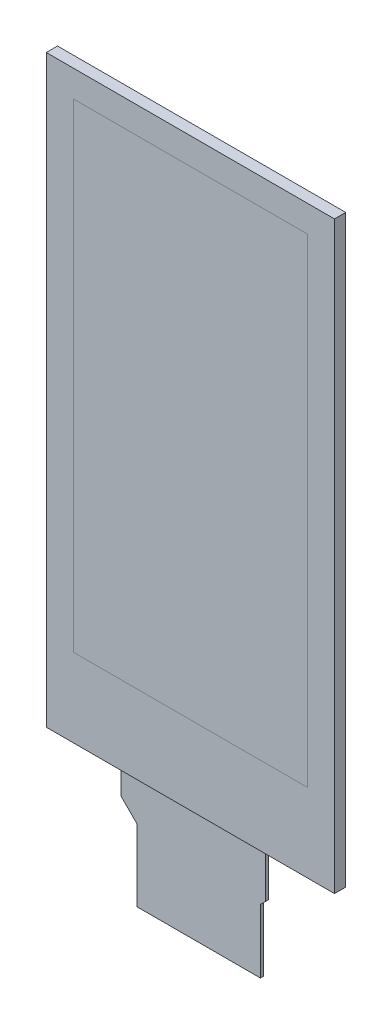
ISO-10303-21;
HEADER;
FILE_DESCRIPTION(('STEP AP214'),'2;1');
FILE_NAME('part.step','',(''),(''),'','','');
FILE_SCHEMA(('AUTOMOTIVE_DESIGN { 1 0 10303 214 1 1 1 1 }'));
ENDSEC;
DATA;
#1=APPLICATION_CONTEXT('core data for automotive mechanical design processes');
#2=APPLICATION_PROTOCOL_DEFINITION('international standard','automotive_design',2000,#1);
#3=PRODUCT_CONTEXT('',#1,'mechanical');
#4=PRODUCT('Part','Part','',(#3));
#5=PRODUCT_RELATED_PRODUCT_CATEGORY('part','',(#4));
#6=PRODUCT_DEFINITION_FORMATION('','',#4);
#7=PRODUCT_DEFINITION_CONTEXT('part definition',#1,'design');
#8=PRODUCT_DEFINITION('design','',#6,#7);
#9=PRODUCT_DEFINITION_SHAPE('','',#8);
#10=(LENGTH_UNIT() NAMED_UNIT(*) SI_UNIT(.MILLI.,.METRE.));
#11=(NAMED_UNIT(*) PLANE_ANGLE_UNIT() SI_UNIT($,.RADIAN.));
#12=(NAMED_UNIT(*) SI_UNIT($,.STERADIAN.) SOLID_ANGLE_UNIT());
#13=UNCERTAINTY_MEASURE_WITH_UNIT(LENGTH_MEASURE(1.E-05),#10,'distance_accuracy_value','');
#14=(GEOMETRIC_REPRESENTATION_CONTEXT(3) GLOBAL_UNCERTAINTY_ASSIGNED_CONTEXT((#13)) GLOBAL_UNIT_ASSIGNED_CONTEXT((#10,
#11,#12)) REPRESENTATION_CONTEXT('',''));
#15=CARTESIAN_POINT('',(0.,0.,0.));
#16=DIRECTION('',(0.,0.,1.));
#17=DIRECTION('',(1.,0.,0.));
#18=AXIS2_PLACEMENT_3D('',#15,#16,#17);
#19=CARTESIAN_POINT('',(22.0111555579125,-22.0111555579118,0.3));
#20=DIRECTION('',(-0.707106781186559,0.707106781186536,0.));
#21=DIRECTION('',(-0.707106781186536,-0.707106781186559,0.));
#22=AXIS2_PLACEMENT_3D('',#19,#20,#21);
#23=PLANE('',#22);
#24=DIRECTION('',(0.707106781186536,0.707106781186559,0.));
#25=VECTOR('',#24,1.);
#26=CARTESIAN_POINT('',(22.0111555579125,-22.0111555579118,0.));
#27=LINE('',#26,#25);
#28=CARTESIAN_POINT('',(6.2505,-37.7718111158248,0.));
#29=VERTEX_POINT('',#28);
#30=CARTESIAN_POINT('',(6.77033142500735,-37.2519796908174,0.));
#31=VERTEX_POINT('',#30);
#32=EDGE_CURVE('E146',#29,#31,#27,.T.);
#33=ORIENTED_EDGE('',*,*,#32,.T.);
#34=DIRECTION('',(0.,0.,-1.));
#35=VECTOR('',#34,1.);
#36=CARTESIAN_POINT('',(6.77033142500735,-37.2519796908174,0.3));
#37=LINE('',#36,#35);
#38=CARTESIAN_POINT('',(6.77033142500735,-37.2519796908174,0.3));
#39=VERTEX_POINT('',#38);
#40=EDGE_CURVE('E12',#39,#31,#37,.T.);
#41=ORIENTED_EDGE('',*,*,#40,.F.);
#42=DIRECTION('',(0.707106781186536,0.707106781186559,0.));
#43=VECTOR('',#42,1.);
#44=CARTESIAN_POINT('',(22.0111555579125,-22.0111555579118,0.3));
#45=LINE('',#44,#43);
#46=CARTESIAN_POINT('',(6.2505,-37.7718111158248,0.3));
#47=VERTEX_POINT('',#46);
#48=EDGE_CURVE('E160',#47,#39,#45,.T.);
#49=ORIENTED_EDGE('',*,*,#48,.F.);
#50=DIRECTION('',(0.,0.,-1.));
#51=VECTOR('',#50,1.);
#52=CARTESIAN_POINT('',(6.2505,-37.7718111158248,0.3));
#53=LINE('',#52,#51);
#54=EDGE_CURVE('E142',#47,#29,#53,.T.);
#55=ORIENTED_EDGE('',*,*,#54,.T.);
#56=EDGE_LOOP('',(#33,#41,#49,#55));
#57=FACE_BOUND('',#56,.T.);
#58=ADVANCED_FACE('F50',(#57),#23,.F.);
#59=CARTESIAN_POINT('',(6.77033142500736,0.,0.3));
#60=DIRECTION('',(-1.,0.,0.));
#61=DIRECTION('',(0.,-1.,0.));
#62=AXIS2_PLACEMENT_3D('',#59,#60,#61);
#63=PLANE('',#62);
#64=DIRECTION('',(0.,1.,0.));
#65=VECTOR('',#64,1.);
#66=CARTESIAN_POINT('',(6.77033142500736,0.,0.));
#67=LINE('',#66,#65);
#68=CARTESIAN_POINT('',(6.77033142500736,-32.225,0.));
#69=VERTEX_POINT('',#68);
#70=EDGE_CURVE('E149',#31,#69,#67,.T.);
#71=ORIENTED_EDGE('',*,*,#70,.T.);
#72=DIRECTION('',(0.,0.,-1.));
#73=VECTOR('',#72,1.);
#74=CARTESIAN_POINT('',(6.77033142500736,-32.225,0.3));
#75=LINE('',#74,#73);
#76=CARTESIAN_POINT('',(6.77033142500736,-32.225,0.3));
#77=VERTEX_POINT('',#76);
#78=EDGE_CURVE('E58',#77,#69,#75,.T.);
#79=ORIENTED_EDGE('',*,*,#78,.F.);
#80=DIRECTION('',(0.,1.,0.));
#81=VECTOR('',#80,1.);
#82=CARTESIAN_POINT('',(6.77033142500736,0.,0.3));
#83=LINE('',#82,#81);
#84=EDGE_CURVE('E109',#39,#77,#83,.T.);
#85=ORIENTED_EDGE('',*,*,#84,.F.);
#86=ORIENTED_EDGE('',*,*,#40,.T.);
#87=EDGE_LOOP('',(#71,#79,#85,#86));
#88=FACE_BOUND('',#87,.T.);
#89=ADVANCED_FACE('F195',(#88),#63,.F.);
#90=CARTESIAN_POINT('',(0.,-32.225,0.3));
#91=DIRECTION('',(0.,-1.,0.));
#92=DIRECTION('',(0.,0.,-1.));
#93=AXIS2_PLACEMENT_3D('',#90,#91,#92);
#94=PLANE('',#93);
#95=DIRECTION('',(-1.,0.,0.));
#96=VECTOR('',#95,1.);
#97=CARTESIAN_POINT('',(0.,-32.225,0.));
#98=LINE('',#97,#96);
#99=CARTESIAN_POINT('',(-7.88303653536633,-32.225,0.));
#100=VERTEX_POINT('',#99);
#101=EDGE_CURVE('E151',#69,#100,#98,.T.);
#102=ORIENTED_EDGE('',*,*,#101,.T.);
#103=DIRECTION('',(0.,0.,-1.));
#104=VECTOR('',#103,1.);
#105=CARTESIAN_POINT('',(-7.88303653536633,-32.225,0.3));
#106=LINE('',#105,#104);
#107=CARTESIAN_POINT('',(-7.88303653536633,-32.225,0.3));
#108=VERTEX_POINT('',#107);
#109=EDGE_CURVE('E167',#108,#100,#106,.T.);
#110=ORIENTED_EDGE('',*,*,#109,.F.);
#111=DIRECTION('',(-1.,0.,0.));
#112=VECTOR('',#111,1.);
#113=CARTESIAN_POINT('',(0.,-32.225,0.3));
#114=LINE('',#113,#112);
#115=EDGE_CURVE('E175',#77,#108,#114,.T.);
#116=ORIENTED_EDGE('',*,*,#115,.F.);
#117=ORIENTED_EDGE('',*,*,#78,.T.);
#118=EDGE_LOOP('',(#102,#110,#116,#117));
#119=FACE_BOUND('',#118,.T.);
#120=ADVANCED_FACE('F173',(#119),#94,.F.);
#121=CARTESIAN_POINT('',(-7.88303653536632,0.,0.3));
#122=DIRECTION('',(1.,0.,0.));
#123=DIRECTION('',(0.,1.,0.));
#124=AXIS2_PLACEMENT_3D('',#121,#122,#123);
#125=PLANE('',#124);
#126=DIRECTION('',(0.,-1.,0.));
#127=VECTOR('',#126,1.);
#128=CARTESIAN_POINT('',(-7.88303653536632,0.,0.));
#129=LINE('',#128,#127);
#130=CARTESIAN_POINT('',(-7.88303653536634,-35.3172476829733,0.));
#131=VERTEX_POINT('',#130);
#132=EDGE_CURVE('E153',#100,#131,#129,.T.);
#133=ORIENTED_EDGE('',*,*,#132,.T.);
#134=DIRECTION('',(0.,0.,-1.));
#135=VECTOR('',#134,1.);
#136=CARTESIAN_POINT('',(-7.88303653536634,-35.3172476829733,0.3));
#137=LINE('',#136,#135);
#138=CARTESIAN_POINT('',(-7.88303653536634,-35.3172476829733,0.3));
#139=VERTEX_POINT('',#138);
#140=EDGE_CURVE('E164',#139,#131,#137,.T.);
#141=ORIENTED_EDGE('',*,*,#140,.F.);
#142=DIRECTION('',(0.,-1.,0.));
#143=VECTOR('',#142,1.);
#144=CARTESIAN_POINT('',(-7.88303653536632,0.,0.3));
#145=LINE('',#144,#143);
#146=EDGE_CURVE('E187',#108,#139,#145,.T.);
#147=ORIENTED_EDGE('',*,*,#146,.F.);
#148=ORIENTED_EDGE('',*,*,#109,.T.);
#149=EDGE_LOOP('',(#133,#141,#147,#148));
#150=FACE_BOUND('',#149,.T.);
#151=ADVANCED_FACE('F183',(#150),#125,.F.);
#152=CARTESIAN_POINT('',(-21.6001421091698,-21.60014210917,0.3));
#153=DIRECTION('',(0.707106781186544,0.707106781186551,0.));
#154=DIRECTION('',(-0.707106781186551,0.707106781186544,0.));
#155=AXIS2_PLACEMENT_3D('',#152,#153,#154);
#156=PLANE('',#155);
#157=DIRECTION('',(0.707106781186551,-0.707106781186544,0.));
#158=VECTOR('',#157,1.);
#159=CARTESIAN_POINT('',(-21.6001421091698,-21.60014210917,0.));
#160=LINE('',#159,#158);
#161=CARTESIAN_POINT('',(-6.24949999999999,-36.9507842183396,0.));
#162=VERTEX_POINT('',#161);
#163=EDGE_CURVE('E155',#131,#162,#160,.T.);
#164=ORIENTED_EDGE('',*,*,#163,.T.);
#165=DIRECTION('',(0.,0.,-1.));
#166=VECTOR('',#165,1.);
#167=CARTESIAN_POINT('',(-6.24949999999999,-36.9507842183396,0.3));
#168=LINE('',#167,#166);
#169=CARTESIAN_POINT('',(-6.24949999999999,-36.9507842183396,0.3));
#170=VERTEX_POINT('',#169);
#171=EDGE_CURVE('E137',#170,#162,#168,.T.);
#172=ORIENTED_EDGE('',*,*,#171,.F.);
#173=DIRECTION('',(0.707106781186551,-0.707106781186544,0.));
#174=VECTOR('',#173,1.);
#175=CARTESIAN_POINT('',(-21.6001421091698,-21.60014210917,0.3));
#176=LINE('',#175,#174);
#177=EDGE_CURVE('E128',#139,#170,#176,.T.);
#178=ORIENTED_EDGE('',*,*,#177,.F.);
#179=ORIENTED_EDGE('',*,*,#140,.T.);
#180=EDGE_LOOP('',(#164,#172,#178,#179));
#181=FACE_BOUND('',#180,.T.);
#182=ADVANCED_FACE('F186',(#181),#156,.F.);
#183=CARTESIAN_POINT('',(-6.24949999999996,0.,0.3));
#184=DIRECTION('',(1.,0.,0.));
#185=DIRECTION('',(0.,1.,0.));
#186=AXIS2_PLACEMENT_3D('',#183,#184,#185);
#187=PLANE('',#186);
#188=DIRECTION('',(0.,-1.,0.));
#189=VECTOR('',#188,1.);
#190=CARTESIAN_POINT('',(-6.24949999999996,0.,0.));
#191=LINE('',#190,#189);
#192=CARTESIAN_POINT('',(-6.2495,-44.225,0.));
#193=VERTEX_POINT('',#192);
#194=EDGE_CURVE('E136',#162,#193,#191,.T.);
#195=ORIENTED_EDGE('',*,*,#194,.T.);
#196=DIRECTION('',(0.,0.,-1.));
#197=VECTOR('',#196,1.);
#198=CARTESIAN_POINT('',(-6.2495,-44.225,0.3));
#199=LINE('',#198,#197);
#200=CARTESIAN_POINT('',(-6.2495,-44.225,0.3));
#201=VERTEX_POINT('',#200);
#202=EDGE_CURVE('E133',#201,#193,#199,.T.);
#203=ORIENTED_EDGE('',*,*,#202,.F.);
#204=DIRECTION('',(0.,-1.,0.));
#205=VECTOR('',#204,1.);
#206=CARTESIAN_POINT('',(-6.24949999999996,0.,0.3));
#207=LINE('',#206,#205);
#208=EDGE_CURVE('E122',#170,#201,#207,.T.);
#209=ORIENTED_EDGE('',*,*,#208,.F.);
#210=ORIENTED_EDGE('',*,*,#171,.T.);
#211=EDGE_LOOP('',(#195,#203,#209,#210));
#212=FACE_BOUND('',#211,.T.);
#213=ADVANCED_FACE('F134',(#212),#187,.F.);
#214=CARTESIAN_POINT('',(0.,-44.225,0.3));
#215=DIRECTION('',(0.,1.,0.));
#216=DIRECTION('',(0.,0.,1.));
#217=AXIS2_PLACEMENT_3D('',#214,#215,#216);
#218=PLANE('',#217);
#219=DIRECTION('',(1.,0.,0.));
#220=VECTOR('',#219,1.);
#221=CARTESIAN_POINT('',(0.,-44.225,0.));
#222=LINE('',#221,#220);
#223=CARTESIAN_POINT('',(6.2505,-44.225,0.));
#224=VERTEX_POINT('',#223);
#225=EDGE_CURVE('E95',#193,#224,#222,.T.);
#226=ORIENTED_EDGE('',*,*,#225,.T.);
#227=DIRECTION('',(0.,0.,-1.));
#228=VECTOR('',#227,1.);
#229=CARTESIAN_POINT('',(6.2505,-44.225,0.3));
#230=LINE('',#229,#228);
#231=CARTESIAN_POINT('',(6.2505,-44.225,0.3));
#232=VERTEX_POINT('',#231);
#233=EDGE_CURVE('E138',#232,#224,#230,.T.);
#234=ORIENTED_EDGE('',*,*,#233,.F.);
#235=DIRECTION('',(1.,0.,0.));
#236=VECTOR('',#235,1.);
#237=CARTESIAN_POINT('',(0.,-44.225,0.3));
#238=LINE('',#237,#236);
#239=EDGE_CURVE('E126',#201,#232,#238,.T.);
#240=ORIENTED_EDGE('',*,*,#239,.F.);
#241=ORIENTED_EDGE('',*,*,#202,.T.);
#242=EDGE_LOOP('',(#226,#234,#240,#241));
#243=FACE_BOUND('',#242,.T.);
#244=ADVANCED_FACE('F140',(#243),#218,.F.);
#245=CARTESIAN_POINT('',(6.2505,0.,0.3));
#246=DIRECTION('',(-1.,0.,0.));
#247=DIRECTION('',(0.,0.,1.));
#248=AXIS2_PLACEMENT_3D('',#245,#246,#247);
#249=PLANE('',#248);
#250=DIRECTION('',(0.,1.,0.));
#251=VECTOR('',#250,1.);
#252=CARTESIAN_POINT('',(6.2505,0.,0.));
#253=LINE('',#252,#251);
#254=EDGE_CURVE('E101',#224,#29,#253,.T.);
#255=ORIENTED_EDGE('',*,*,#254,.T.);
#256=ORIENTED_EDGE('',*,*,#54,.F.);
#257=DIRECTION('',(0.,1.,0.));
#258=VECTOR('',#257,1.);
#259=CARTESIAN_POINT('',(6.2505,0.,0.3));
#260=LINE('',#259,#258);
#261=EDGE_CURVE('E66',#232,#47,#260,.T.);
#262=ORIENTED_EDGE('',*,*,#261,.F.);
#263=ORIENTED_EDGE('',*,*,#233,.T.);
#264=EDGE_LOOP('',(#255,#256,#262,#263));
#265=FACE_BOUND('',#264,.T.);
#266=ADVANCED_FACE('F211',(#265),#249,.F.);
#267=CARTESIAN_POINT('',(0.,0.,0.3));
#268=DIRECTION('',(0.,0.,1.));
#269=DIRECTION('',(1.,0.,0.));
#270=AXIS2_PLACEMENT_3D('',#267,#268,#269);
#271=PLANE('',#270);
#272=ORIENTED_EDGE('',*,*,#48,.T.);
#273=ORIENTED_EDGE('',*,*,#84,.T.);
#274=ORIENTED_EDGE('',*,*,#115,.T.);
#275=ORIENTED_EDGE('',*,*,#146,.T.);
#276=ORIENTED_EDGE('',*,*,#177,.T.);
#277=ORIENTED_EDGE('',*,*,#208,.T.);
#278=ORIENTED_EDGE('',*,*,#239,.T.);
#279=ORIENTED_EDGE('',*,*,#261,.T.);
#280=EDGE_LOOP('',(#272,#273,#274,#275,#276,#277,#278,#279));
#281=FACE_BOUND('',#280,.T.);
#282=ADVANCED_FACE('F124',(#281),#271,.T.);
#283=CARTESIAN_POINT('',(0.,0.,0.));
#284=DIRECTION('',(0.,0.,1.));
#285=DIRECTION('',(1.,0.,0.));
#286=AXIS2_PLACEMENT_3D('',#283,#284,#285);
#287=PLANE('',#286);
#288=ORIENTED_EDGE('',*,*,#32,.F.);
#289=ORIENTED_EDGE('',*,*,#254,.F.);
#290=ORIENTED_EDGE('',*,*,#225,.F.);
#291=ORIENTED_EDGE('',*,*,#194,.F.);
#292=ORIENTED_EDGE('',*,*,#163,.F.);
#293=ORIENTED_EDGE('',*,*,#132,.F.);
#294=ORIENTED_EDGE('',*,*,#101,.F.);
#295=ORIENTED_EDGE('',*,*,#70,.F.);
#296=EDGE_LOOP('',(#288,#289,#290,#291,#292,#293,#294,#295));
#297=FACE_BOUND('',#296,.T.);
#298=ADVANCED_FACE('F179',(#297),#287,.F.);
#299=CLOSED_SHELL('',(#58,#89,#120,#151,#182,#213,#244,#266,#282,#298));
#300=MANIFOLD_SOLID_BREP('B2',#299);
#301=CARTESIAN_POINT('',(0.,26.975,1.14));
#302=DIRECTION('',(0.,-1.,0.));
#303=DIRECTION('',(0.,0.,-1.));
#304=AXIS2_PLACEMENT_3D('',#301,#302,#303);
#305=PLANE('',#304);
#306=DIRECTION('',(-1.,0.,0.));
#307=VECTOR('',#306,1.);
#308=CARTESIAN_POINT('',(0.,26.975,0.));
#309=LINE('',#308,#307);
#310=CARTESIAN_POINT('',(14.6005,26.975,0.));
#311=VERTEX_POINT('',#310);
#312=CARTESIAN_POINT('',(-14.5995,26.975,0.));
#313=VERTEX_POINT('',#312);
#314=EDGE_CURVE('E394',#311,#313,#309,.T.);
#315=ORIENTED_EDGE('',*,*,#314,.T.);
#316=DIRECTION('',(0.,0.,-1.));
#317=VECTOR('',#316,1.);
#318=CARTESIAN_POINT('',(-14.5995,26.975,1.14));
#319=LINE('',#318,#317);
#320=CARTESIAN_POINT('',(-14.5995,26.975,1.14));
#321=VERTEX_POINT('',#320);
#322=EDGE_CURVE('E48',#321,#313,#319,.T.);
#323=ORIENTED_EDGE('',*,*,#322,.F.);
#324=DIRECTION('',(-1.,0.,0.));
#325=VECTOR('',#324,1.);
#326=CARTESIAN_POINT('',(0.,26.975,1.14));
#327=LINE('',#326,#325);
#328=CARTESIAN_POINT('',(14.6005,26.975,1.14));
#329=VERTEX_POINT('',#328);
#330=EDGE_CURVE('E366',#329,#321,#327,.T.);
#331=ORIENTED_EDGE('',*,*,#330,.F.);
#332=DIRECTION('',(0.,0.,-1.));
#333=VECTOR('',#332,1.);
#334=CARTESIAN_POINT('',(14.6005,26.975,1.14));
#335=LINE('',#334,#333);
#336=EDGE_CURVE('E306',#329,#311,#335,.T.);
#337=ORIENTED_EDGE('',*,*,#336,.T.);
#338=EDGE_LOOP('',(#315,#323,#331,#337));
#339=FACE_BOUND('',#338,.T.);
#340=ADVANCED_FACE('F287',(#339),#305,.F.);
#341=CARTESIAN_POINT('',(-14.5995,0.,1.14));
#342=DIRECTION('',(1.,0.,0.));
#343=DIRECTION('',(0.,0.,-1.));
#344=AXIS2_PLACEMENT_3D('',#341,#342,#343);
#345=PLANE('',#344);
#346=DIRECTION('',(0.,-1.,0.));
#347=VECTOR('',#346,1.);
#348=CARTESIAN_POINT('',(-14.5995,0.,0.));
#349=LINE('',#348,#347);
#350=CARTESIAN_POINT('',(-14.5995,-32.225,0.));
#351=VERTEX_POINT('',#350);
#352=EDGE_CURVE('E372',#313,#351,#349,.T.);
#353=ORIENTED_EDGE('',*,*,#352,.T.);
#354=DIRECTION('',(0.,0.,-1.));
#355=VECTOR('',#354,1.);
#356=CARTESIAN_POINT('',(-14.5995,-32.225,1.14));
#357=LINE('',#356,#355);
#358=CARTESIAN_POINT('',(-14.5995,-32.225,1.14));
#359=VERTEX_POINT('',#358);
#360=EDGE_CURVE('E297',#359,#351,#357,.T.);
#361=ORIENTED_EDGE('',*,*,#360,.F.);
#362=DIRECTION('',(0.,-1.,0.));
#363=VECTOR('',#362,1.);
#364=CARTESIAN_POINT('',(-14.5995,0.,1.14));
#365=LINE('',#364,#363);
#366=EDGE_CURVE('E360',#321,#359,#365,.T.);
#367=ORIENTED_EDGE('',*,*,#366,.F.);
#368=ORIENTED_EDGE('',*,*,#322,.T.);
#369=EDGE_LOOP('',(#353,#361,#367,#368));
#370=FACE_BOUND('',#369,.T.);
#371=ADVANCED_FACE('F371',(#370),#345,.F.);
#372=CARTESIAN_POINT('',(0.,-32.225,1.14));
#373=DIRECTION('',(0.,-1.,0.));
#374=DIRECTION('',(0.,0.,-1.));
#375=AXIS2_PLACEMENT_3D('',#372,#373,#374);
#376=PLANE('',#375);
#377=DIRECTION('',(-1.,0.,0.));
#378=VECTOR('',#377,1.);
#379=CARTESIAN_POINT('',(0.,-32.225,0.));
#380=LINE('',#379,#378);
#381=CARTESIAN_POINT('',(14.6005,-32.225,0.));
#382=VERTEX_POINT('',#381);
#383=EDGE_CURVE('E397',#382,#351,#380,.T.);
#384=ORIENTED_EDGE('',*,*,#383,.F.);
#385=DIRECTION('',(0.,0.,-1.));
#386=VECTOR('',#385,1.);
#387=CARTESIAN_POINT('',(14.6005,-32.225,1.14));
#388=LINE('',#387,#386);
#389=CARTESIAN_POINT('',(14.6005,-32.225,1.14));
#390=VERTEX_POINT('',#389);
#391=EDGE_CURVE('E332',#390,#382,#388,.T.);
#392=ORIENTED_EDGE('',*,*,#391,.F.);
#393=DIRECTION('',(-1.,0.,0.));
#394=VECTOR('',#393,1.);
#395=CARTESIAN_POINT('',(0.,-32.225,1.14));
#396=LINE('',#395,#394);
#397=EDGE_CURVE('E365',#390,#359,#396,.T.);
#398=ORIENTED_EDGE('',*,*,#397,.T.);
#399=ORIENTED_EDGE('',*,*,#360,.T.);
#400=EDGE_LOOP('',(#384,#392,#398,#399));
#401=FACE_BOUND('',#400,.T.);
#402=ADVANCED_FACE('F376',(#401),#376,.T.);
#403=CARTESIAN_POINT('',(-11.8525,0.,1.14));
#404=DIRECTION('',(1.,0.,0.));
#405=DIRECTION('',(0.,0.,-1.));
#406=AXIS2_PLACEMENT_3D('',#403,#404,#405);
#407=PLANE('',#406);
#408=DIRECTION('',(0.,-1.,0.));
#409=VECTOR('',#408,1.);
#410=CARTESIAN_POINT('',(-11.8525,0.,0.));
#411=LINE('',#410,#409);
#412=CARTESIAN_POINT('',(-11.8525,24.275,0.));
#413=VERTEX_POINT('',#412);
#414=CARTESIAN_POINT('',(-11.8525,-24.275,0.));
#415=VERTEX_POINT('',#414);
#416=EDGE_CURVE('E383',#413,#415,#411,.T.);
#417=ORIENTED_EDGE('',*,*,#416,.F.);
#418=DIRECTION('',(0.,0.,-1.));
#419=VECTOR('',#418,1.);
#420=CARTESIAN_POINT('',(-11.8525,24.275,1.14));
#421=LINE('',#420,#419);
#422=CARTESIAN_POINT('',(-11.8525,24.275,1.14));
#423=VERTEX_POINT('',#422);
#424=EDGE_CURVE('E291',#423,#413,#421,.T.);
#425=ORIENTED_EDGE('',*,*,#424,.F.);
#426=DIRECTION('',(0.,-1.,0.));
#427=VECTOR('',#426,1.);
#428=CARTESIAN_POINT('',(-11.8525,0.,1.14));
#429=LINE('',#428,#427);
#430=CARTESIAN_POINT('',(-11.8525,-24.275,1.14));
#431=VERTEX_POINT('',#430);
#432=EDGE_CURVE('E402',#423,#431,#429,.T.);
#433=ORIENTED_EDGE('',*,*,#432,.T.);
#434=DIRECTION('',(0.,0.,-1.));
#435=VECTOR('',#434,1.);
#436=CARTESIAN_POINT('',(-11.8525,-24.275,1.14));
#437=LINE('',#436,#435);
#438=EDGE_CURVE('E379',#431,#415,#437,.T.);
#439=ORIENTED_EDGE('',*,*,#438,.T.);
#440=EDGE_LOOP('',(#417,#425,#433,#439));
#441=FACE_BOUND('',#440,.T.);
#442=ADVANCED_FACE('F289',(#441),#407,.T.);
#443=CARTESIAN_POINT('',(0.,24.275,1.14));
#444=DIRECTION('',(0.,-1.,0.));
#445=DIRECTION('',(0.,0.,-1.));
#446=AXIS2_PLACEMENT_3D('',#443,#444,#445);
#447=PLANE('',#446);
#448=DIRECTION('',(-1.,0.,0.));
#449=VECTOR('',#448,1.);
#450=CARTESIAN_POINT('',(0.,24.275,0.));
#451=LINE('',#450,#449);
#452=CARTESIAN_POINT('',(11.8525,24.275,0.));
#453=VERTEX_POINT('',#452);
#454=EDGE_CURVE('E386',#453,#413,#451,.T.);
#455=ORIENTED_EDGE('',*,*,#454,.F.);
#456=DIRECTION('',(0.,0.,-1.));
#457=VECTOR('',#456,1.);
#458=CARTESIAN_POINT('',(11.8525,24.275,1.14));
#459=LINE('',#458,#457);
#460=CARTESIAN_POINT('',(11.8525,24.275,1.14));
#461=VERTEX_POINT('',#460);
#462=EDGE_CURVE('E408',#461,#453,#459,.T.);
#463=ORIENTED_EDGE('',*,*,#462,.F.);
#464=DIRECTION('',(-1.,0.,0.));
#465=VECTOR('',#464,1.);
#466=CARTESIAN_POINT('',(0.,24.275,1.14));
#467=LINE('',#466,#465);
#468=EDGE_CURVE('E417',#461,#423,#467,.T.);
#469=ORIENTED_EDGE('',*,*,#468,.T.);
#470=ORIENTED_EDGE('',*,*,#424,.T.);
#471=EDGE_LOOP('',(#455,#463,#469,#470));
#472=FACE_BOUND('',#471,.T.);
#473=ADVANCED_FACE('F415',(#472),#447,.T.);
#474=CARTESIAN_POINT('',(11.8525,0.,1.14));
#475=DIRECTION('',(1.,0.,0.));
#476=DIRECTION('',(0.,0.,-1.));
#477=AXIS2_PLACEMENT_3D('',#474,#475,#476);
#478=PLANE('',#477);
#479=DIRECTION('',(0.,-1.,0.));
#480=VECTOR('',#479,1.);
#481=CARTESIAN_POINT('',(11.8525,0.,0.));
#482=LINE('',#481,#480);
#483=CARTESIAN_POINT('',(11.8525,-24.275,0.));
#484=VERTEX_POINT('',#483);
#485=EDGE_CURVE('E389',#453,#484,#482,.T.);
#486=ORIENTED_EDGE('',*,*,#485,.T.);
#487=DIRECTION('',(0.,0.,-1.));
#488=VECTOR('',#487,1.);
#489=CARTESIAN_POINT('',(11.8525,-24.275,1.14));
#490=LINE('',#489,#488);
#491=CARTESIAN_POINT('',(11.8525,-24.275,1.14));
#492=VERTEX_POINT('',#491);
#493=EDGE_CURVE('E406',#492,#484,#490,.T.);
#494=ORIENTED_EDGE('',*,*,#493,.F.);
#495=DIRECTION('',(0.,-1.,0.));
#496=VECTOR('',#495,1.);
#497=CARTESIAN_POINT('',(11.8525,0.,1.14));
#498=LINE('',#497,#496);
#499=EDGE_CURVE('E430',#461,#492,#498,.T.);
#500=ORIENTED_EDGE('',*,*,#499,.F.);
#501=ORIENTED_EDGE('',*,*,#462,.T.);
#502=EDGE_LOOP('',(#486,#494,#500,#501));
#503=FACE_BOUND('',#502,.T.);
#504=ADVANCED_FACE('F424',(#503),#478,.F.);
#505=CARTESIAN_POINT('',(0.,-24.275,1.14));
#506=DIRECTION('',(0.,-1.,0.));
#507=DIRECTION('',(0.,0.,-1.));
#508=AXIS2_PLACEMENT_3D('',#505,#506,#507);
#509=PLANE('',#508);
#510=DIRECTION('',(-1.,0.,0.));
#511=VECTOR('',#510,1.);
#512=CARTESIAN_POINT('',(0.,-24.275,0.));
#513=LINE('',#512,#511);
#514=EDGE_CURVE('E391',#484,#415,#513,.T.);
#515=ORIENTED_EDGE('',*,*,#514,.T.);
#516=ORIENTED_EDGE('',*,*,#438,.F.);
#517=DIRECTION('',(-1.,0.,0.));
#518=VECTOR('',#517,1.);
#519=CARTESIAN_POINT('',(0.,-24.275,1.14));
#520=LINE('',#519,#518);
#521=EDGE_CURVE('E428',#492,#431,#520,.T.);
#522=ORIENTED_EDGE('',*,*,#521,.F.);
#523=ORIENTED_EDGE('',*,*,#493,.T.);
#524=EDGE_LOOP('',(#515,#516,#522,#523));
#525=FACE_BOUND('',#524,.T.);
#526=ADVANCED_FACE('F427',(#525),#509,.F.);
#527=CARTESIAN_POINT('',(14.6005,0.,1.14));
#528=DIRECTION('',(1.,0.,0.));
#529=DIRECTION('',(0.,0.,-1.));
#530=AXIS2_PLACEMENT_3D('',#527,#528,#529);
#531=PLANE('',#530);
#532=DIRECTION('',(0.,-1.,0.));
#533=VECTOR('',#532,1.);
#534=CARTESIAN_POINT('',(14.6005,0.,0.));
#535=LINE('',#534,#533);
#536=EDGE_CURVE('E399',#311,#382,#535,.T.);
#537=ORIENTED_EDGE('',*,*,#536,.F.);
#538=ORIENTED_EDGE('',*,*,#336,.F.);
#539=DIRECTION('',(0.,-1.,0.));
#540=VECTOR('',#539,1.);
#541=CARTESIAN_POINT('',(14.6005,0.,1.14));
#542=LINE('',#541,#540);
#543=EDGE_CURVE('E377',#329,#390,#542,.T.);
#544=ORIENTED_EDGE('',*,*,#543,.T.);
#545=ORIENTED_EDGE('',*,*,#391,.T.);
#546=EDGE_LOOP('',(#537,#538,#544,#545));
#547=FACE_BOUND('',#546,.T.);
#548=ADVANCED_FACE('F436',(#547),#531,.T.);
#549=CARTESIAN_POINT('',(0.,0.,1.14));
#550=DIRECTION('',(0.,0.,1.));
#551=DIRECTION('',(1.,0.,0.));
#552=AXIS2_PLACEMENT_3D('',#549,#550,#551);
#553=PLANE('',#552);
#554=ORIENTED_EDGE('',*,*,#432,.F.);
#555=ORIENTED_EDGE('',*,*,#468,.F.);
#556=ORIENTED_EDGE('',*,*,#499,.T.);
#557=ORIENTED_EDGE('',*,*,#521,.T.);
#558=EDGE_LOOP('',(#554,#555,#556,#557));
#559=FACE_BOUND('',#558,.T.);
#560=ORIENTED_EDGE('',*,*,#330,.T.);
#561=ORIENTED_EDGE('',*,*,#366,.T.);
#562=ORIENTED_EDGE('',*,*,#397,.F.);
#563=ORIENTED_EDGE('',*,*,#543,.F.);
#564=EDGE_LOOP('',(#560,#561,#562,#563));
#565=FACE_BOUND('',#564,.T.);
#566=ADVANCED_FACE('F362',(#559,#565),#553,.T.);
#567=CARTESIAN_POINT('',(0.,0.,0.));
#568=DIRECTION('',(0.,0.,1.));
#569=DIRECTION('',(1.,0.,0.));
#570=AXIS2_PLACEMENT_3D('',#567,#568,#569);
#571=PLANE('',#570);
#572=ORIENTED_EDGE('',*,*,#416,.T.);
#573=ORIENTED_EDGE('',*,*,#514,.F.);
#574=ORIENTED_EDGE('',*,*,#485,.F.);
#575=ORIENTED_EDGE('',*,*,#454,.T.);
#576=EDGE_LOOP('',(#572,#573,#574,#575));
#577=FACE_BOUND('',#576,.T.);
#578=ORIENTED_EDGE('',*,*,#314,.F.);
#579=ORIENTED_EDGE('',*,*,#536,.T.);
#580=ORIENTED_EDGE('',*,*,#383,.T.);
#581=ORIENTED_EDGE('',*,*,#352,.F.);
#582=EDGE_LOOP('',(#578,#579,#580,#581));
#583=FACE_BOUND('',#582,.T.);
#584=ADVANCED_FACE('F421',(#577,#583),#571,.F.);
#585=CLOSED_SHELL('',(#340,#371,#402,#442,#473,#504,#526,#548,#566,#584));
#586=MANIFOLD_SOLID_BREP('B6',#585);
#587=CARTESIAN_POINT('',(0.,24.275,1.14));
#588=DIRECTION('',(0.,-1.,0.));
#589=DIRECTION('',(0.,0.,-1.));
#590=AXIS2_PLACEMENT_3D('',#587,#588,#589);
#591=PLANE('',#590);
#592=DIRECTION('',(-1.,0.,0.));
#593=VECTOR('',#592,1.);
#594=CARTESIAN_POINT('',(0.,24.275,0.));
#595=LINE('',#594,#593);
#596=CARTESIAN_POINT('',(11.8525,24.275,0.));
#597=VERTEX_POINT('',#596);
#598=CARTESIAN_POINT('',(-11.8525,24.275,0.));
#599=VERTEX_POINT('',#598);
#600=EDGE_CURVE('E580',#597,#599,#595,.T.);
#601=ORIENTED_EDGE('',*,*,#600,.T.);
#602=DIRECTION('',(0.,0.,-1.));
#603=VECTOR('',#602,1.);
#604=CARTESIAN_POINT('',(-11.8525,24.275,1.14));
#605=LINE('',#604,#603);
#606=CARTESIAN_POINT('',(-11.8525,24.275,1.14));
#607=VERTEX_POINT('',#606);
#608=EDGE_CURVE('E285',#607,#599,#605,.T.);
#609=ORIENTED_EDGE('',*,*,#608,.F.);
#610=DIRECTION('',(-1.,0.,0.));
#611=VECTOR('',#610,1.);
#612=CARTESIAN_POINT('',(0.,24.275,1.14));
#613=LINE('',#612,#611);
#614=CARTESIAN_POINT('',(11.8525,24.275,1.14));
#615=VERTEX_POINT('',#614);
#616=EDGE_CURVE('E566',#615,#607,#613,.T.);
#617=ORIENTED_EDGE('',*,*,#616,.F.);
#618=DIRECTION('',(0.,0.,-1.));
#619=VECTOR('',#618,1.);
#620=CARTESIAN_POINT('',(11.8525,24.275,1.14));
#621=LINE('',#620,#619);
#622=EDGE_CURVE('E533',#615,#597,#621,.T.);
#623=ORIENTED_EDGE('',*,*,#622,.T.);
#624=EDGE_LOOP('',(#601,#609,#617,#623));
#625=FACE_BOUND('',#624,.T.);
#626=ADVANCED_FACE('F517',(#625),#591,.F.);
#627=CARTESIAN_POINT('',(-11.8525,0.,1.14));
#628=DIRECTION('',(1.,0.,0.));
#629=DIRECTION('',(0.,0.,-1.));
#630=AXIS2_PLACEMENT_3D('',#627,#628,#629);
#631=PLANE('',#630);
#632=DIRECTION('',(0.,-1.,0.));
#633=VECTOR('',#632,1.);
#634=CARTESIAN_POINT('',(-11.8525,0.,0.));
#635=LINE('',#634,#633);
#636=CARTESIAN_POINT('',(-11.8525,-24.275,0.));
#637=VERTEX_POINT('',#636);
#638=EDGE_CURVE('E571',#599,#637,#635,.T.);
#639=ORIENTED_EDGE('',*,*,#638,.T.);
#640=DIRECTION('',(0.,0.,-1.));
#641=VECTOR('',#640,1.);
#642=CARTESIAN_POINT('',(-11.8525,-24.275,1.14));
#643=LINE('',#642,#641);
#644=CARTESIAN_POINT('',(-11.8525,-24.275,1.14));
#645=VERTEX_POINT('',#644);
#646=EDGE_CURVE('E525',#645,#637,#643,.T.);
#647=ORIENTED_EDGE('',*,*,#646,.F.);
#648=DIRECTION('',(0.,-1.,0.));
#649=VECTOR('',#648,1.);
#650=CARTESIAN_POINT('',(-11.8525,0.,1.14));
#651=LINE('',#650,#649);
#652=EDGE_CURVE('E558',#607,#645,#651,.T.);
#653=ORIENTED_EDGE('',*,*,#652,.F.);
#654=ORIENTED_EDGE('',*,*,#608,.T.);
#655=EDGE_LOOP('',(#639,#647,#653,#654));
#656=FACE_BOUND('',#655,.T.);
#657=ADVANCED_FACE('F570',(#656),#631,.F.);
#658=CARTESIAN_POINT('',(0.,-24.275,1.14));
#659=DIRECTION('',(0.,-1.,0.));
#660=DIRECTION('',(0.,0.,-1.));
#661=AXIS2_PLACEMENT_3D('',#658,#659,#660);
#662=PLANE('',#661);
#663=DIRECTION('',(-1.,0.,0.));
#664=VECTOR('',#663,1.);
#665=CARTESIAN_POINT('',(0.,-24.275,0.));
#666=LINE('',#665,#664);
#667=CARTESIAN_POINT('',(11.8525,-24.275,0.));
#668=VERTEX_POINT('',#667);
#669=EDGE_CURVE('E583',#668,#637,#666,.T.);
#670=ORIENTED_EDGE('',*,*,#669,.F.);
#671=DIRECTION('',(0.,0.,-1.));
#672=VECTOR('',#671,1.);
#673=CARTESIAN_POINT('',(11.8525,-24.275,1.14));
#674=LINE('',#673,#672);
#675=CARTESIAN_POINT('',(11.8525,-24.275,1.14));
#676=VERTEX_POINT('',#675);
#677=EDGE_CURVE('E547',#676,#668,#674,.T.);
#678=ORIENTED_EDGE('',*,*,#677,.F.);
#679=DIRECTION('',(-1.,0.,0.));
#680=VECTOR('',#679,1.);
#681=CARTESIAN_POINT('',(0.,-24.275,1.14));
#682=LINE('',#681,#680);
#683=EDGE_CURVE('E565',#676,#645,#682,.T.);
#684=ORIENTED_EDGE('',*,*,#683,.T.);
#685=ORIENTED_EDGE('',*,*,#646,.T.);
#686=EDGE_LOOP('',(#670,#678,#684,#685));
#687=FACE_BOUND('',#686,.T.);
#688=ADVANCED_FACE('F574',(#687),#662,.T.);
#689=CARTESIAN_POINT('',(11.8525,0.,1.14));
#690=DIRECTION('',(1.,0.,0.));
#691=DIRECTION('',(0.,0.,-1.));
#692=AXIS2_PLACEMENT_3D('',#689,#690,#691);
#693=PLANE('',#692);
#694=DIRECTION('',(0.,-1.,0.));
#695=VECTOR('',#694,1.);
#696=CARTESIAN_POINT('',(11.8525,0.,0.));
#697=LINE('',#696,#695);
#698=EDGE_CURVE('E585',#597,#668,#697,.T.);
#699=ORIENTED_EDGE('',*,*,#698,.F.);
#700=ORIENTED_EDGE('',*,*,#622,.F.);
#701=DIRECTION('',(0.,-1.,0.));
#702=VECTOR('',#701,1.);
#703=CARTESIAN_POINT('',(11.8525,0.,1.14));
#704=LINE('',#703,#702);
#705=EDGE_CURVE('E575',#615,#676,#704,.T.);
#706=ORIENTED_EDGE('',*,*,#705,.T.);
#707=ORIENTED_EDGE('',*,*,#677,.T.);
#708=EDGE_LOOP('',(#699,#700,#706,#707));
#709=FACE_BOUND('',#708,.T.);
#710=ADVANCED_FACE('F591',(#709),#693,.T.);
#711=CARTESIAN_POINT('',(0.,0.,1.14));
#712=DIRECTION('',(0.,0.,1.));
#713=DIRECTION('',(1.,0.,0.));
#714=AXIS2_PLACEMENT_3D('',#711,#712,#713);
#715=PLANE('',#714);
#716=ORIENTED_EDGE('',*,*,#616,.T.);
#717=ORIENTED_EDGE('',*,*,#652,.T.);
#718=ORIENTED_EDGE('',*,*,#683,.F.);
#719=ORIENTED_EDGE('',*,*,#705,.F.);
#720=EDGE_LOOP('',(#716,#717,#718,#719));
#721=FACE_BOUND('',#720,.T.);
#722=ADVANCED_FACE('F562',(#721),#715,.T.);
#723=CARTESIAN_POINT('',(0.,0.,0.));
#724=DIRECTION('',(0.,0.,1.));
#725=DIRECTION('',(1.,0.,0.));
#726=AXIS2_PLACEMENT_3D('',#723,#724,#725);
#727=PLANE('',#726);
#728=ORIENTED_EDGE('',*,*,#600,.F.);
#729=ORIENTED_EDGE('',*,*,#698,.T.);
#730=ORIENTED_EDGE('',*,*,#669,.T.);
#731=ORIENTED_EDGE('',*,*,#638,.F.);
#732=EDGE_LOOP('',(#728,#729,#730,#731));
#733=FACE_BOUND('',#732,.T.);
#734=ADVANCED_FACE('F590',(#733),#727,.F.);
#735=CLOSED_SHELL('',(#626,#657,#688,#710,#722,#734));
#736=MANIFOLD_SOLID_BREP('B42',#735);
#737=ADVANCED_BREP_SHAPE_REPRESENTATION('',(#18,#300,#586,#736),#14);
#738=SHAPE_DEFINITION_REPRESENTATION(#9,#737);
ENDSEC;
END-ISO-10303-21;
